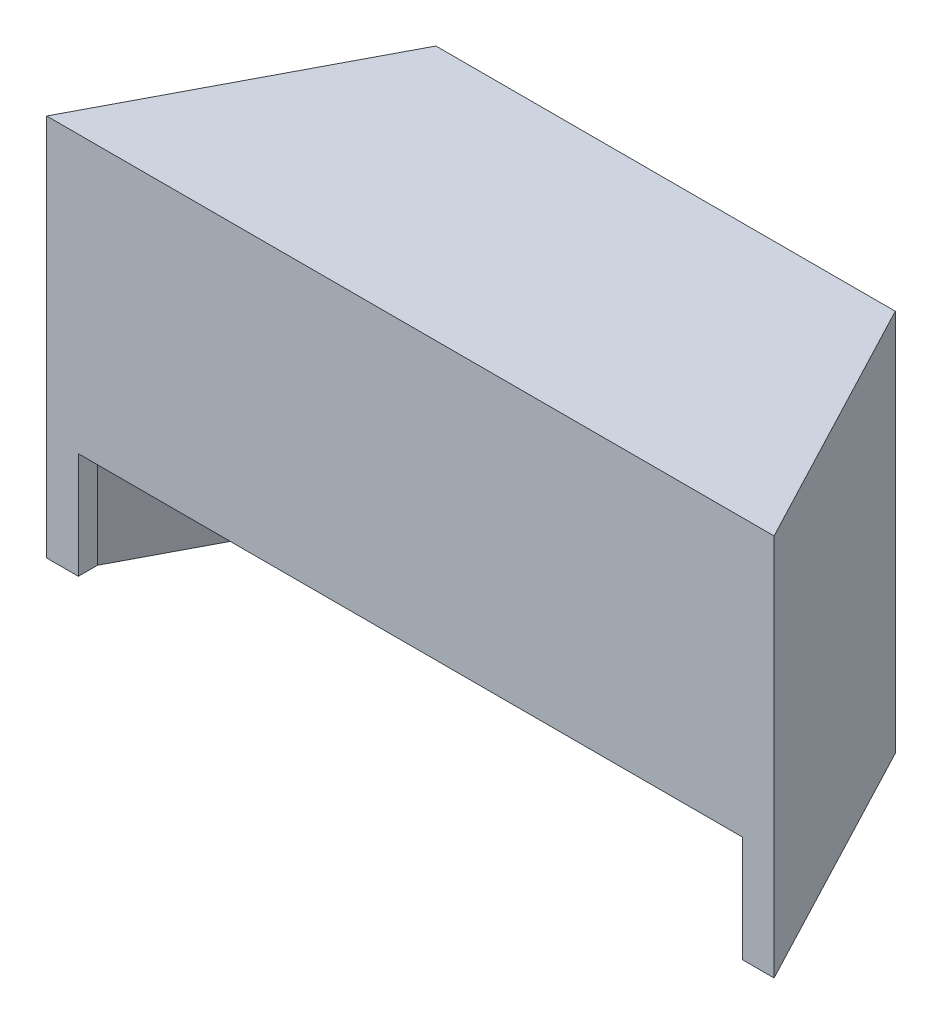
ISO-10303-21;
HEADER;
FILE_DESCRIPTION(('STEP AP214'),'2;1');
FILE_NAME('part.step','',(''),(''),'','','');
FILE_SCHEMA(('AUTOMOTIVE_DESIGN { 1 0 10303 214 1 1 1 1 }'));
ENDSEC;
DATA;
#1=APPLICATION_CONTEXT('core data for automotive mechanical design processes');
#2=APPLICATION_PROTOCOL_DEFINITION('international standard','automotive_design',2000,#1);
#3=PRODUCT_CONTEXT('',#1,'mechanical');
#4=PRODUCT('Part','Part','',(#3));
#5=PRODUCT_RELATED_PRODUCT_CATEGORY('part','',(#4));
#6=PRODUCT_DEFINITION_FORMATION('','',#4);
#7=PRODUCT_DEFINITION_CONTEXT('part definition',#1,'design');
#8=PRODUCT_DEFINITION('design','',#6,#7);
#9=PRODUCT_DEFINITION_SHAPE('','',#8);
#10=(LENGTH_UNIT() NAMED_UNIT(*) SI_UNIT(.MILLI.,.METRE.));
#11=(NAMED_UNIT(*) PLANE_ANGLE_UNIT() SI_UNIT($,.RADIAN.));
#12=(NAMED_UNIT(*) SI_UNIT($,.STERADIAN.) SOLID_ANGLE_UNIT());
#13=UNCERTAINTY_MEASURE_WITH_UNIT(LENGTH_MEASURE(1.E-05),#10,'distance_accuracy_value','');
#14=(GEOMETRIC_REPRESENTATION_CONTEXT(3) GLOBAL_UNCERTAINTY_ASSIGNED_CONTEXT((#13)) GLOBAL_UNIT_ASSIGNED_CONTEXT((#10,
#11,#12)) REPRESENTATION_CONTEXT('',''));
#15=CARTESIAN_POINT('',(0.,0.,0.));
#16=DIRECTION('',(0.,0.,1.));
#17=DIRECTION('',(1.,0.,0.));
#18=AXIS2_PLACEMENT_3D('',#15,#16,#17);
#19=CARTESIAN_POINT('',(0.,0.,0.));
#20=DIRECTION('',(0.,-1.,0.));
#21=DIRECTION('',(0.,0.,-1.));
#22=AXIS2_PLACEMENT_3D('',#19,#20,#21);
#23=PLANE('',#22);
#24=DIRECTION('',(0.,0.,-1.));
#25=VECTOR('',#24,1.);
#26=CARTESIAN_POINT('',(26.0183464502885,0.,8.70589788065409));
#27=LINE('',#26,#25);
#28=CARTESIAN_POINT('',(26.0183464502885,0.,0.20589788065409));
#29=VERTEX_POINT('',#28);
#30=CARTESIAN_POINT('',(26.0183464502885,0.,-1.29410211934591));
#31=VERTEX_POINT('',#30);
#32=EDGE_CURVE('E136',#29,#31,#27,.T.);
#33=ORIENTED_EDGE('',*,*,#32,.T.);
#34=DIRECTION('',(-0.464833898989921,0.,-0.885397902837944));
#35=VECTOR('',#34,1.);
#36=CARTESIAN_POINT('',(20.9291524256307,0.,-10.9878050234561));
#37=LINE('',#36,#35);
#38=CARTESIAN_POINT('',(18.,0.,-16.5671429770383));
#39=VERTEX_POINT('',#38);
#40=EDGE_CURVE('E149',#31,#39,#37,.T.);
#41=ORIENTED_EDGE('',*,*,#40,.T.);
#42=DIRECTION('',(0.,0.,-1.));
#43=VECTOR('',#42,1.);
#44=CARTESIAN_POINT('',(18.,0.,-9.79410211934591));
#45=LINE('',#44,#43);
#46=CARTESIAN_POINT('',(18.,0.,-19.7941021193459));
#47=VERTEX_POINT('',#46);
#48=EDGE_CURVE('E203',#39,#47,#45,.T.);
#49=ORIENTED_EDGE('',*,*,#48,.T.);
#50=DIRECTION('',(-0.464833898989921,0.,-0.885397902837944));
#51=VECTOR('',#50,1.);
#52=CARTESIAN_POINT('',(18.,0.,-19.7941021193459));
#53=LINE('',#52,#51);
#54=CARTESIAN_POINT('',(28.5,0.,0.205897880654088));
#55=VERTEX_POINT('',#54);
#56=EDGE_CURVE('E174',#55,#47,#53,.T.);
#57=ORIENTED_EDGE('',*,*,#56,.F.);
#58=DIRECTION('',(1.,0.,0.));
#59=VECTOR('',#58,1.);
#60=CARTESIAN_POINT('',(-28.5,0.,0.205897880654091));
#61=LINE('',#60,#59);
#62=EDGE_CURVE('E151',#29,#55,#61,.T.);
#63=ORIENTED_EDGE('',*,*,#62,.F.);
#64=EDGE_LOOP('',(#33,#41,#49,#57,#63));
#65=FACE_BOUND('',#64,.T.);
#66=ADVANCED_FACE('F33',(#65),#23,.T.);
#67=DIRECTION('',(0.,0.,-1.));
#68=VECTOR('',#67,1.);
#69=CARTESIAN_POINT('',(-26.0183464502885,0.,8.70589788065409));
#70=LINE('',#69,#68);
#71=CARTESIAN_POINT('',(-26.0183464502885,0.,0.20589788065409));
#72=VERTEX_POINT('',#71);
#73=CARTESIAN_POINT('',(-26.0183464502885,0.,-1.29410211934591));
#74=VERTEX_POINT('',#73);
#75=EDGE_CURVE('E152',#72,#74,#70,.T.);
#76=ORIENTED_EDGE('',*,*,#75,.F.);
#77=CARTESIAN_POINT('',(-28.5,0.,0.205897880654091));
#78=VERTEX_POINT('',#77);
#79=EDGE_CURVE('E184',#78,#72,#61,.T.);
#80=ORIENTED_EDGE('',*,*,#79,.F.);
#81=DIRECTION('',(-0.464833898989921,0.,0.885397902837944));
#82=VECTOR('',#81,1.);
#83=CARTESIAN_POINT('',(-28.5,0.,0.205897880654091));
#84=LINE('',#83,#82);
#85=CARTESIAN_POINT('',(-18.,0.,-19.7941021193459));
#86=VERTEX_POINT('',#85);
#87=EDGE_CURVE('E181',#86,#78,#84,.T.);
#88=ORIENTED_EDGE('',*,*,#87,.F.);
#89=DIRECTION('',(0.,0.,-1.));
#90=VECTOR('',#89,1.);
#91=CARTESIAN_POINT('',(-18.,0.,-9.79410211934591));
#92=LINE('',#91,#90);
#93=CARTESIAN_POINT('',(-18.,0.,-16.5671429770383));
#94=VERTEX_POINT('',#93);
#95=EDGE_CURVE('E249',#94,#86,#92,.T.);
#96=ORIENTED_EDGE('',*,*,#95,.F.);
#97=DIRECTION('',(-0.464833898989921,0.,0.885397902837944));
#98=VECTOR('',#97,1.);
#99=CARTESIAN_POINT('',(-20.9291524256307,0.,-10.9878050234561));
#100=LINE('',#99,#98);
#101=EDGE_CURVE('E158',#94,#74,#100,.T.);
#102=ORIENTED_EDGE('',*,*,#101,.T.);
#103=EDGE_LOOP('',(#76,#80,#88,#96,#102));
#104=FACE_BOUND('',#103,.T.);
#105=ADVANCED_FACE('F286',(#104),#23,.T.);
#106=CARTESIAN_POINT('',(-18.,30.,-19.7941021193459));
#107=DIRECTION('',(0.,0.,1.));
#108=DIRECTION('',(1.,0.,0.));
#109=AXIS2_PLACEMENT_3D('',#106,#107,#108);
#110=PLANE('',#109);
#111=DIRECTION('',(0.,-1.,0.));
#112=VECTOR('',#111,1.);
#113=CARTESIAN_POINT('',(18.,30.,-19.7941021193459));
#114=LINE('',#113,#112);
#115=CARTESIAN_POINT('',(18.,30.,-19.7941021193459));
#116=VERTEX_POINT('',#115);
#117=CARTESIAN_POINT('',(18.,8.3,-19.7941021193459));
#118=VERTEX_POINT('',#117);
#119=EDGE_CURVE('E180',#116,#118,#114,.T.);
#120=ORIENTED_EDGE('',*,*,#119,.T.);
#121=DIRECTION('',(1.,0.,0.));
#122=VECTOR('',#121,1.);
#123=CARTESIAN_POINT('',(18.,8.3,-19.7941021193459));
#124=LINE('',#123,#122);
#125=CARTESIAN_POINT('',(-18.,8.3,-19.7941021193459));
#126=VERTEX_POINT('',#125);
#127=EDGE_CURVE('E252',#126,#118,#124,.T.);
#128=ORIENTED_EDGE('',*,*,#127,.F.);
#129=DIRECTION('',(0.,-1.,0.));
#130=VECTOR('',#129,1.);
#131=CARTESIAN_POINT('',(-18.,30.,-19.7941021193459));
#132=LINE('',#131,#130);
#133=CARTESIAN_POINT('',(-18.,30.,-19.7941021193459));
#134=VERTEX_POINT('',#133);
#135=EDGE_CURVE('E197',#134,#126,#132,.T.);
#136=ORIENTED_EDGE('',*,*,#135,.F.);
#137=DIRECTION('',(-1.,0.,0.));
#138=VECTOR('',#137,1.);
#139=CARTESIAN_POINT('',(-18.,30.,-19.7941021193459));
#140=LINE('',#139,#138);
#141=EDGE_CURVE('E170',#116,#134,#140,.T.);
#142=ORIENTED_EDGE('',*,*,#141,.F.);
#143=EDGE_LOOP('',(#120,#128,#136,#142));
#144=FACE_BOUND('',#143,.T.);
#145=ADVANCED_FACE('F35',(#144),#110,.F.);
#146=CARTESIAN_POINT('',(-28.5,30.,0.205897880654091));
#147=DIRECTION('',(0.885397902837943,0.,0.46483389898992));
#148=DIRECTION('',(0.464833898989921,0.,-0.885397902837944));
#149=AXIS2_PLACEMENT_3D('',#146,#147,#148);
#150=PLANE('',#149);
#151=ORIENTED_EDGE('',*,*,#87,.T.);
#152=DIRECTION('',(0.,-1.,0.));
#153=VECTOR('',#152,1.);
#154=CARTESIAN_POINT('',(-28.5,30.,0.205897880654091));
#155=LINE('',#154,#153);
#156=CARTESIAN_POINT('',(-28.5,30.,0.205897880654091));
#157=VERTEX_POINT('',#156);
#158=EDGE_CURVE('E194',#157,#78,#155,.T.);
#159=ORIENTED_EDGE('',*,*,#158,.F.);
#160=DIRECTION('',(-0.464833898989921,0.,0.885397902837944));
#161=VECTOR('',#160,1.);
#162=CARTESIAN_POINT('',(-28.5,30.,0.205897880654091));
#163=LINE('',#162,#161);
#164=EDGE_CURVE('E173',#134,#157,#163,.T.);
#165=ORIENTED_EDGE('',*,*,#164,.F.);
#166=ORIENTED_EDGE('',*,*,#135,.T.);
#167=DIRECTION('',(0.,1.,0.));
#168=VECTOR('',#167,1.);
#169=CARTESIAN_POINT('',(-18.,0.,-19.7941021193459));
#170=LINE('',#169,#168);
#171=EDGE_CURVE('E247',#86,#126,#170,.T.);
#172=ORIENTED_EDGE('',*,*,#171,.F.);
#173=EDGE_LOOP('',(#151,#159,#165,#166,#172));
#174=FACE_BOUND('',#173,.T.);
#175=ADVANCED_FACE('F302',(#174),#150,.F.);
#176=CARTESIAN_POINT('',(-28.5,30.,0.205897880654091));
#177=DIRECTION('',(0.,0.,-1.));
#178=DIRECTION('',(-1.,0.,0.));
#179=AXIS2_PLACEMENT_3D('',#176,#177,#178);
#180=PLANE('',#179);
#181=DIRECTION('',(1.,0.,0.));
#182=VECTOR('',#181,1.);
#183=CARTESIAN_POINT('',(-28.5,8.32291746103968,0.205897880654091));
#184=LINE('',#183,#182);
#185=CARTESIAN_POINT('',(-26.0183464502885,8.32291746103968,0.205897880654091));
#186=VERTEX_POINT('',#185);
#187=CARTESIAN_POINT('',(26.0183464502885,8.32291746103968,0.20589788065409));
#188=VERTEX_POINT('',#187);
#189=EDGE_CURVE('E257',#186,#188,#184,.T.);
#190=ORIENTED_EDGE('',*,*,#189,.T.);
#191=DIRECTION('',(0.,-1.,0.));
#192=VECTOR('',#191,1.);
#193=CARTESIAN_POINT('',(26.0183464502885,30.,0.205897880654088));
#194=LINE('',#193,#192);
#195=EDGE_CURVE('E263',#188,#29,#194,.T.);
#196=ORIENTED_EDGE('',*,*,#195,.T.);
#197=ORIENTED_EDGE('',*,*,#62,.T.);
#198=DIRECTION('',(0.,-1.,0.));
#199=VECTOR('',#198,1.);
#200=CARTESIAN_POINT('',(28.5,30.,0.205897880654088));
#201=LINE('',#200,#199);
#202=CARTESIAN_POINT('',(28.5,30.,0.205897880654088));
#203=VERTEX_POINT('',#202);
#204=EDGE_CURVE('E191',#203,#55,#201,.T.);
#205=ORIENTED_EDGE('',*,*,#204,.F.);
#206=DIRECTION('',(1.,0.,0.));
#207=VECTOR('',#206,1.);
#208=CARTESIAN_POINT('',(-28.5,30.,0.205897880654091));
#209=LINE('',#208,#207);
#210=EDGE_CURVE('E176',#157,#203,#209,.T.);
#211=ORIENTED_EDGE('',*,*,#210,.F.);
#212=ORIENTED_EDGE('',*,*,#158,.T.);
#213=ORIENTED_EDGE('',*,*,#79,.T.);
#214=DIRECTION('',(0.,1.,0.));
#215=VECTOR('',#214,1.);
#216=CARTESIAN_POINT('',(-26.0183464502885,30.,0.205897880654091));
#217=LINE('',#216,#215);
#218=EDGE_CURVE('E260',#72,#186,#217,.T.);
#219=ORIENTED_EDGE('',*,*,#218,.T.);
#220=EDGE_LOOP('',(#190,#196,#197,#205,#211,#212,#213,#219));
#221=FACE_BOUND('',#220,.T.);
#222=ADVANCED_FACE('F299',(#221),#180,.F.);
#223=CARTESIAN_POINT('',(18.,30.,-19.7941021193459));
#224=DIRECTION('',(-0.885397902837944,0.,0.464833898989921));
#225=DIRECTION('',(0.464833898989921,0.,0.885397902837944));
#226=AXIS2_PLACEMENT_3D('',#223,#224,#225);
#227=PLANE('',#226);
#228=ORIENTED_EDGE('',*,*,#56,.T.);
#229=DIRECTION('',(0.,-1.,0.));
#230=VECTOR('',#229,1.);
#231=CARTESIAN_POINT('',(18.,0.,-19.7941021193459));
#232=LINE('',#231,#230);
#233=EDGE_CURVE('E255',#118,#47,#232,.T.);
#234=ORIENTED_EDGE('',*,*,#233,.F.);
#235=ORIENTED_EDGE('',*,*,#119,.F.);
#236=DIRECTION('',(-0.464833898989921,0.,-0.885397902837944));
#237=VECTOR('',#236,1.);
#238=CARTESIAN_POINT('',(18.,30.,-19.7941021193459));
#239=LINE('',#238,#237);
#240=EDGE_CURVE('E178',#203,#116,#239,.T.);
#241=ORIENTED_EDGE('',*,*,#240,.F.);
#242=ORIENTED_EDGE('',*,*,#204,.T.);
#243=EDGE_LOOP('',(#228,#234,#235,#241,#242));
#244=FACE_BOUND('',#243,.T.);
#245=ADVANCED_FACE('F296',(#244),#227,.F.);
#246=CARTESIAN_POINT('',(0.,30.,0.));
#247=DIRECTION('',(0.,-1.,0.));
#248=DIRECTION('',(0.,0.,-1.));
#249=AXIS2_PLACEMENT_3D('',#246,#247,#248);
#250=PLANE('',#249);
#251=ORIENTED_EDGE('',*,*,#141,.T.);
#252=ORIENTED_EDGE('',*,*,#164,.T.);
#253=ORIENTED_EDGE('',*,*,#210,.T.);
#254=ORIENTED_EDGE('',*,*,#240,.T.);
#255=EDGE_LOOP('',(#251,#252,#253,#254));
#256=FACE_BOUND('',#255,.T.);
#257=ADVANCED_FACE('F294',(#256),#250,.F.);
#258=CARTESIAN_POINT('',(-18.,30.,-18.2941021193459));
#259=DIRECTION('',(0.,0.,1.));
#260=DIRECTION('',(1.,0.,0.));
#261=AXIS2_PLACEMENT_3D('',#258,#259,#260);
#262=PLANE('',#261);
#263=DIRECTION('',(-1.,0.,0.));
#264=VECTOR('',#263,1.);
#265=CARTESIAN_POINT('',(-18.,8.3,-18.2941021193459));
#266=LINE('',#265,#264);
#267=CARTESIAN_POINT('',(17.0933464502885,8.3,-18.2941021193459));
#268=VERTEX_POINT('',#267);
#269=CARTESIAN_POINT('',(-17.0933464502885,8.3,-18.2941021193459));
#270=VERTEX_POINT('',#269);
#271=EDGE_CURVE('E209',#268,#270,#266,.T.);
#272=ORIENTED_EDGE('',*,*,#271,.F.);
#273=DIRECTION('',(0.,-1.,0.));
#274=VECTOR('',#273,1.);
#275=CARTESIAN_POINT('',(17.0933464502885,30.,-18.2941021193459));
#276=LINE('',#275,#274);
#277=CARTESIAN_POINT('',(17.0933464502885,28.5,-18.2941021193459));
#278=VERTEX_POINT('',#277);
#279=EDGE_CURVE('E206',#278,#268,#276,.T.);
#280=ORIENTED_EDGE('',*,*,#279,.F.);
#281=DIRECTION('',(-1.,0.,0.));
#282=VECTOR('',#281,1.);
#283=CARTESIAN_POINT('',(0.,28.5,-18.2941021193459));
#284=LINE('',#283,#282);
#285=CARTESIAN_POINT('',(-17.0933464502885,28.5,-18.2941021193459));
#286=VERTEX_POINT('',#285);
#287=EDGE_CURVE('E157',#278,#286,#284,.T.);
#288=ORIENTED_EDGE('',*,*,#287,.T.);
#289=DIRECTION('',(0.,-1.,0.));
#290=VECTOR('',#289,1.);
#291=CARTESIAN_POINT('',(-17.0933464502885,30.,-18.2941021193459));
#292=LINE('',#291,#290);
#293=EDGE_CURVE('E183',#286,#270,#292,.T.);
#294=ORIENTED_EDGE('',*,*,#293,.T.);
#295=EDGE_LOOP('',(#272,#280,#288,#294));
#296=FACE_BOUND('',#295,.T.);
#297=ADVANCED_FACE('F213',(#296),#262,.T.);
#298=CARTESIAN_POINT('',(-27.1719031457431,30.,0.903148729138972));
#299=DIRECTION('',(0.885397902837943,0.,0.46483389898992));
#300=DIRECTION('',(0.464833898989921,0.,-0.885397902837944));
#301=AXIS2_PLACEMENT_3D('',#298,#299,#300);
#302=PLANE('',#301);
#303=DIRECTION('',(-0.464833898989921,0.,0.885397902837944));
#304=VECTOR('',#303,1.);
#305=CARTESIAN_POINT('',(-27.1719031457431,8.3,0.903148729138972));
#306=LINE('',#305,#304);
#307=CARTESIAN_POINT('',(-18.,8.3,-16.5671429770383));
#308=VERTEX_POINT('',#307);
#309=EDGE_CURVE('E164',#270,#308,#306,.T.);
#310=ORIENTED_EDGE('',*,*,#309,.F.);
#311=ORIENTED_EDGE('',*,*,#293,.F.);
#312=DIRECTION('',(-0.464833898989921,0.,0.885397902837944));
#313=VECTOR('',#312,1.);
#314=CARTESIAN_POINT('',(-20.9291524256307,28.5,-10.9878050234561));
#315=LINE('',#314,#313);
#316=CARTESIAN_POINT('',(-26.0183464502885,28.5,-1.29410211934591));
#317=VERTEX_POINT('',#316);
#318=EDGE_CURVE('E161',#286,#317,#315,.T.);
#319=ORIENTED_EDGE('',*,*,#318,.T.);
#320=DIRECTION('',(0.,-1.,0.));
#321=VECTOR('',#320,1.);
#322=CARTESIAN_POINT('',(-26.0183464502885,30.,-1.29410211934591));
#323=LINE('',#322,#321);
#324=CARTESIAN_POINT('',(-26.0183464502885,8.32291746103968,-1.29410211934591));
#325=VERTEX_POINT('',#324);
#326=EDGE_CURVE('E223',#317,#325,#323,.T.);
#327=ORIENTED_EDGE('',*,*,#326,.T.);
#328=DIRECTION('',(0.,1.,0.));
#329=VECTOR('',#328,1.);
#330=CARTESIAN_POINT('',(-26.0183464502885,0.,-1.29410211934591));
#331=LINE('',#330,#329);
#332=EDGE_CURVE('E143',#74,#325,#331,.T.);
#333=ORIENTED_EDGE('',*,*,#332,.F.);
#334=ORIENTED_EDGE('',*,*,#101,.F.);
#335=DIRECTION('',(0.,-1.,0.));
#336=VECTOR('',#335,1.);
#337=CARTESIAN_POINT('',(-18.,30.,-16.5671429770383));
#338=LINE('',#337,#336);
#339=EDGE_CURVE('E11',#308,#94,#338,.T.);
#340=ORIENTED_EDGE('',*,*,#339,.F.);
#341=EDGE_LOOP('',(#310,#311,#319,#327,#333,#334,#340));
#342=FACE_BOUND('',#341,.T.);
#343=ADVANCED_FACE('F238',(#342),#302,.T.);
#344=CARTESIAN_POINT('',(-28.5,30.,-1.29410211934591));
#345=DIRECTION('',(0.,0.,-1.));
#346=DIRECTION('',(-1.,0.,0.));
#347=AXIS2_PLACEMENT_3D('',#344,#345,#346);
#348=PLANE('',#347);
#349=DIRECTION('',(1.,0.,0.));
#350=VECTOR('',#349,1.);
#351=CARTESIAN_POINT('',(26.0183464502885,8.32291746103968,-1.29410211934591));
#352=LINE('',#351,#350);
#353=CARTESIAN_POINT('',(26.0183464502885,8.32291746103968,-1.29410211934591));
#354=VERTEX_POINT('',#353);
#355=EDGE_CURVE('E48',#325,#354,#352,.T.);
#356=ORIENTED_EDGE('',*,*,#355,.F.);
#357=ORIENTED_EDGE('',*,*,#326,.F.);
#358=DIRECTION('',(1.,0.,0.));
#359=VECTOR('',#358,1.);
#360=CARTESIAN_POINT('',(0.,28.5,-1.29410211934591));
#361=LINE('',#360,#359);
#362=CARTESIAN_POINT('',(26.0183464502885,28.5,-1.29410211934591));
#363=VERTEX_POINT('',#362);
#364=EDGE_CURVE('E230',#317,#363,#361,.T.);
#365=ORIENTED_EDGE('',*,*,#364,.T.);
#366=DIRECTION('',(0.,-1.,0.));
#367=VECTOR('',#366,1.);
#368=CARTESIAN_POINT('',(26.0183464502885,30.,-1.29410211934591));
#369=LINE('',#368,#367);
#370=EDGE_CURVE('E226',#363,#354,#369,.T.);
#371=ORIENTED_EDGE('',*,*,#370,.T.);
#372=EDGE_LOOP('',(#356,#357,#365,#371));
#373=FACE_BOUND('',#372,.T.);
#374=ADVANCED_FACE('F276',(#373),#348,.T.);
#375=CARTESIAN_POINT('',(16.6719031457431,30.,-19.096851270861));
#376=DIRECTION('',(-0.885397902837944,0.,0.464833898989921));
#377=DIRECTION('',(0.464833898989921,0.,0.885397902837944));
#378=AXIS2_PLACEMENT_3D('',#375,#376,#377);
#379=PLANE('',#378);
#380=DIRECTION('',(0.,1.,0.));
#381=VECTOR('',#380,1.);
#382=CARTESIAN_POINT('',(18.,30.,-16.5671429770383));
#383=LINE('',#382,#381);
#384=CARTESIAN_POINT('',(18.,8.3,-16.5671429770383));
#385=VERTEX_POINT('',#384);
#386=EDGE_CURVE('E41',#39,#385,#383,.T.);
#387=ORIENTED_EDGE('',*,*,#386,.F.);
#388=ORIENTED_EDGE('',*,*,#40,.F.);
#389=DIRECTION('',(0.,-1.,0.));
#390=VECTOR('',#389,1.);
#391=CARTESIAN_POINT('',(26.0183464502885,0.,-1.29410211934591));
#392=LINE('',#391,#390);
#393=EDGE_CURVE('E133',#354,#31,#392,.T.);
#394=ORIENTED_EDGE('',*,*,#393,.F.);
#395=ORIENTED_EDGE('',*,*,#370,.F.);
#396=DIRECTION('',(-0.464833898989921,0.,-0.885397902837944));
#397=VECTOR('',#396,1.);
#398=CARTESIAN_POINT('',(20.9291524256307,28.5,-10.9878050234561));
#399=LINE('',#398,#397);
#400=EDGE_CURVE('E167',#363,#278,#399,.T.);
#401=ORIENTED_EDGE('',*,*,#400,.T.);
#402=ORIENTED_EDGE('',*,*,#279,.T.);
#403=DIRECTION('',(-0.464833898989921,0.,-0.885397902837944));
#404=VECTOR('',#403,1.);
#405=CARTESIAN_POINT('',(16.6719031457431,8.3,-19.096851270861));
#406=LINE('',#405,#404);
#407=EDGE_CURVE('E200',#385,#268,#406,.T.);
#408=ORIENTED_EDGE('',*,*,#407,.F.);
#409=EDGE_LOOP('',(#387,#388,#394,#395,#401,#402,#408));
#410=FACE_BOUND('',#409,.T.);
#411=ADVANCED_FACE('F155',(#410),#379,.T.);
#412=CARTESIAN_POINT('',(0.,28.5,0.));
#413=DIRECTION('',(0.,-1.,0.));
#414=DIRECTION('',(0.,0.,-1.));
#415=AXIS2_PLACEMENT_3D('',#412,#413,#414);
#416=PLANE('',#415);
#417=ORIENTED_EDGE('',*,*,#287,.F.);
#418=ORIENTED_EDGE('',*,*,#400,.F.);
#419=ORIENTED_EDGE('',*,*,#364,.F.);
#420=ORIENTED_EDGE('',*,*,#318,.F.);
#421=EDGE_LOOP('',(#417,#418,#419,#420));
#422=FACE_BOUND('',#421,.T.);
#423=ADVANCED_FACE('F236',(#422),#416,.T.);
#424=CARTESIAN_POINT('',(18.,0.,-9.79410211934591));
#425=DIRECTION('',(1.,0.,0.));
#426=DIRECTION('',(0.,0.,-1.));
#427=AXIS2_PLACEMENT_3D('',#424,#425,#426);
#428=PLANE('',#427);
#429=ORIENTED_EDGE('',*,*,#386,.T.);
#430=DIRECTION('',(0.,0.,-1.));
#431=VECTOR('',#430,1.);
#432=CARTESIAN_POINT('',(18.,8.3,-9.79410211934591));
#433=LINE('',#432,#431);
#434=EDGE_CURVE('E56',#385,#118,#433,.T.);
#435=ORIENTED_EDGE('',*,*,#434,.T.);
#436=ORIENTED_EDGE('',*,*,#233,.T.);
#437=ORIENTED_EDGE('',*,*,#48,.F.);
#438=EDGE_LOOP('',(#429,#435,#436,#437));
#439=FACE_BOUND('',#438,.T.);
#440=ADVANCED_FACE('F202',(#439),#428,.F.);
#441=CARTESIAN_POINT('',(18.,8.3,-9.79410211934591));
#442=DIRECTION('',(0.,1.,0.));
#443=DIRECTION('',(0.,0.,1.));
#444=AXIS2_PLACEMENT_3D('',#441,#442,#443);
#445=PLANE('',#444);
#446=ORIENTED_EDGE('',*,*,#309,.T.);
#447=DIRECTION('',(0.,0.,-1.));
#448=VECTOR('',#447,1.);
#449=CARTESIAN_POINT('',(-18.,8.3,-9.79410211934591));
#450=LINE('',#449,#448);
#451=EDGE_CURVE('E218',#308,#126,#450,.T.);
#452=ORIENTED_EDGE('',*,*,#451,.T.);
#453=ORIENTED_EDGE('',*,*,#127,.T.);
#454=ORIENTED_EDGE('',*,*,#434,.F.);
#455=ORIENTED_EDGE('',*,*,#407,.T.);
#456=ORIENTED_EDGE('',*,*,#271,.T.);
#457=EDGE_LOOP('',(#446,#452,#453,#454,#455,#456));
#458=FACE_BOUND('',#457,.T.);
#459=ADVANCED_FACE('F208',(#458),#445,.F.);
#460=CARTESIAN_POINT('',(-18.,0.,-9.79410211934591));
#461=DIRECTION('',(-1.,0.,0.));
#462=DIRECTION('',(0.,0.,1.));
#463=AXIS2_PLACEMENT_3D('',#460,#461,#462);
#464=PLANE('',#463);
#465=ORIENTED_EDGE('',*,*,#339,.T.);
#466=ORIENTED_EDGE('',*,*,#95,.T.);
#467=ORIENTED_EDGE('',*,*,#171,.T.);
#468=ORIENTED_EDGE('',*,*,#451,.F.);
#469=EDGE_LOOP('',(#465,#466,#467,#468));
#470=FACE_BOUND('',#469,.T.);
#471=ADVANCED_FACE('F244',(#470),#464,.F.);
#472=CARTESIAN_POINT('',(26.0183464502885,8.32291746103968,8.70589788065409));
#473=DIRECTION('',(0.,1.,0.));
#474=DIRECTION('',(0.,0.,1.));
#475=AXIS2_PLACEMENT_3D('',#472,#473,#474);
#476=PLANE('',#475);
#477=DIRECTION('',(0.,0.,-1.));
#478=VECTOR('',#477,1.);
#479=CARTESIAN_POINT('',(-26.0183464502885,8.32291746103968,8.70589788065409));
#480=LINE('',#479,#478);
#481=EDGE_CURVE('E266',#186,#325,#480,.T.);
#482=ORIENTED_EDGE('',*,*,#481,.T.);
#483=ORIENTED_EDGE('',*,*,#355,.T.);
#484=DIRECTION('',(0.,0.,-1.));
#485=VECTOR('',#484,1.);
#486=CARTESIAN_POINT('',(26.0183464502885,8.32291746103968,8.70589788065409));
#487=LINE('',#486,#485);
#488=EDGE_CURVE('E138',#188,#354,#487,.T.);
#489=ORIENTED_EDGE('',*,*,#488,.F.);
#490=ORIENTED_EDGE('',*,*,#189,.F.);
#491=EDGE_LOOP('',(#482,#483,#489,#490));
#492=FACE_BOUND('',#491,.T.);
#493=ADVANCED_FACE('F333',(#492),#476,.F.);
#494=CARTESIAN_POINT('',(-26.0183464502885,0.,8.70589788065409));
#495=DIRECTION('',(-1.,0.,0.));
#496=DIRECTION('',(0.,0.,1.));
#497=AXIS2_PLACEMENT_3D('',#494,#495,#496);
#498=PLANE('',#497);
#499=ORIENTED_EDGE('',*,*,#75,.T.);
#500=ORIENTED_EDGE('',*,*,#332,.T.);
#501=ORIENTED_EDGE('',*,*,#481,.F.);
#502=ORIENTED_EDGE('',*,*,#218,.F.);
#503=EDGE_LOOP('',(#499,#500,#501,#502));
#504=FACE_BOUND('',#503,.T.);
#505=ADVANCED_FACE('F274',(#504),#498,.F.);
#506=CARTESIAN_POINT('',(26.0183464502885,0.,8.70589788065409));
#507=DIRECTION('',(1.,0.,0.));
#508=DIRECTION('',(0.,0.,-1.));
#509=AXIS2_PLACEMENT_3D('',#506,#507,#508);
#510=PLANE('',#509);
#511=ORIENTED_EDGE('',*,*,#488,.T.);
#512=ORIENTED_EDGE('',*,*,#393,.T.);
#513=ORIENTED_EDGE('',*,*,#32,.F.);
#514=ORIENTED_EDGE('',*,*,#195,.F.);
#515=EDGE_LOOP('',(#511,#512,#513,#514));
#516=FACE_BOUND('',#515,.T.);
#517=ADVANCED_FACE('F135',(#516),#510,.F.);
#518=CLOSED_SHELL('',(#66,#105,#145,#175,#222,#245,#257,#297,#343,#374,#411,#423,#440,#459,#471,
#493,#505,#517));
#519=MANIFOLD_SOLID_BREP('B2',#518);
#520=ADVANCED_BREP_SHAPE_REPRESENTATION('',(#18,#519),#14);
#521=SHAPE_DEFINITION_REPRESENTATION(#9,#520);
ENDSEC;
END-ISO-10303-21;
